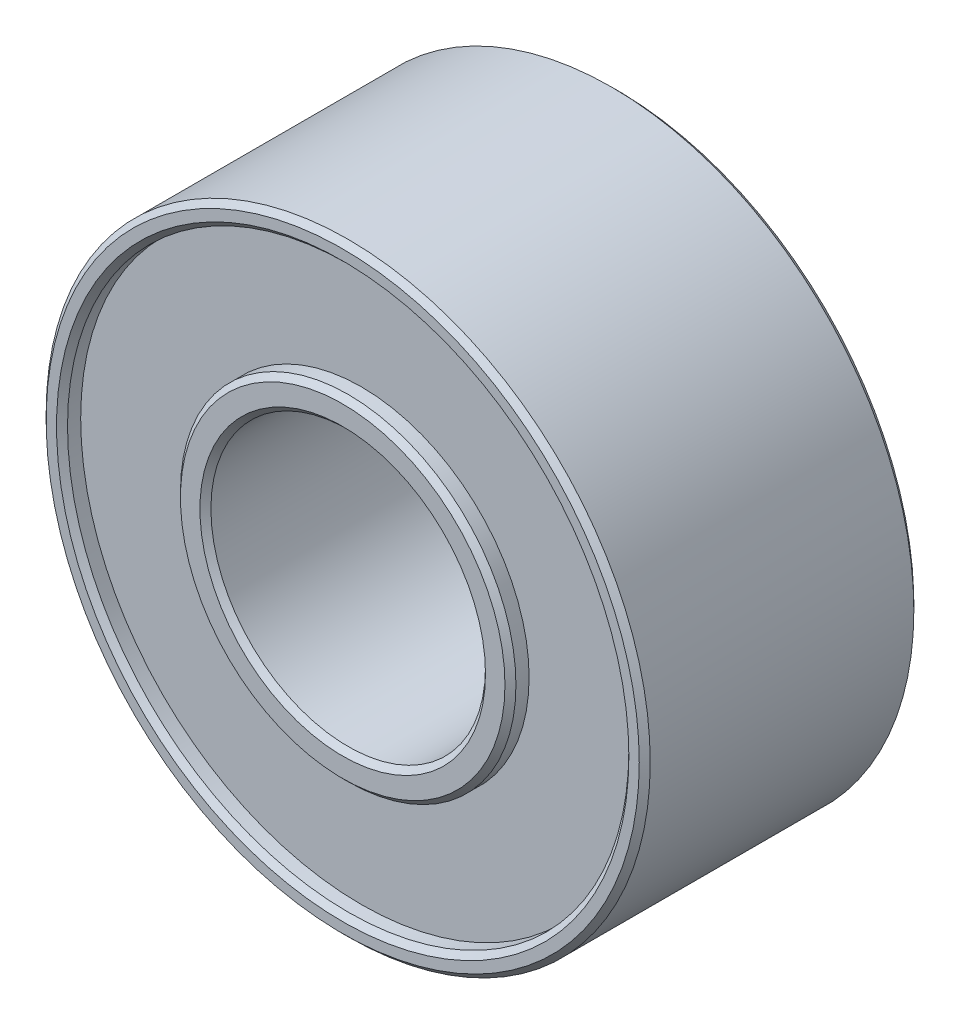
ISO-10303-21;
HEADER;
FILE_DESCRIPTION(('STEP AP214'),'2;1');
FILE_NAME('part.step','',(''),(''),'','','');
FILE_SCHEMA(('AUTOMOTIVE_DESIGN { 1 0 10303 214 1 1 1 1 }'));
ENDSEC;
DATA;
#1=APPLICATION_CONTEXT('core data for automotive mechanical design processes');
#2=APPLICATION_PROTOCOL_DEFINITION('international standard','automotive_design',2000,#1);
#3=PRODUCT_CONTEXT('',#1,'mechanical');
#4=PRODUCT('Part','Part','',(#3));
#5=PRODUCT_RELATED_PRODUCT_CATEGORY('part','',(#4));
#6=PRODUCT_DEFINITION_FORMATION('','',#4);
#7=PRODUCT_DEFINITION_CONTEXT('part definition',#1,'design');
#8=PRODUCT_DEFINITION('design','',#6,#7);
#9=PRODUCT_DEFINITION_SHAPE('','',#8);
#10=(LENGTH_UNIT() NAMED_UNIT(*) SI_UNIT(.MILLI.,.METRE.));
#11=(NAMED_UNIT(*) PLANE_ANGLE_UNIT() SI_UNIT($,.RADIAN.));
#12=(NAMED_UNIT(*) SI_UNIT($,.STERADIAN.) SOLID_ANGLE_UNIT());
#13=UNCERTAINTY_MEASURE_WITH_UNIT(LENGTH_MEASURE(1.E-05),#10,'distance_accuracy_value','');
#14=(GEOMETRIC_REPRESENTATION_CONTEXT(3) GLOBAL_UNCERTAINTY_ASSIGNED_CONTEXT((#13)) GLOBAL_UNIT_ASSIGNED_CONTEXT((#10,
#11,#12)) REPRESENTATION_CONTEXT('',''));
#15=CARTESIAN_POINT('',(0.,0.,0.));
#16=DIRECTION('',(0.,0.,1.));
#17=DIRECTION('',(1.,0.,0.));
#18=AXIS2_PLACEMENT_3D('',#15,#16,#17);
#19=CARTESIAN_POINT('',(0.,3.05451224312112,-2.5));
#20=DIRECTION('',(0.,0.,-1.));
#21=DIRECTION('',(-1.,0.,0.));
#22=AXIS2_PLACEMENT_3D('',#19,#20,#21);
#23=PLANE('',#22);
#24=CARTESIAN_POINT('',(0.,0.,-2.5));
#25=DIRECTION('',(0.,0.,-1.));
#26=DIRECTION('',(-1.,0.,0.));
#27=AXIS2_PLACEMENT_3D('',#24,#25,#26);
#28=CIRCLE('',#27,2.95451224312112);
#29=CARTESIAN_POINT('',(-2.95451224312112,0.,-2.5));
#30=VERTEX_POINT('',#29);
#31=EDGE_CURVE('E73',#30,#30,#28,.T.);
#32=ORIENTED_EDGE('',*,*,#31,.T.);
#33=EDGE_LOOP('',(#32));
#34=FACE_BOUND('',#33,.T.);
#35=CARTESIAN_POINT('',(0.,0.,-2.5));
#36=DIRECTION('',(0.,0.,-1.));
#37=DIRECTION('',(-1.,0.,0.));
#38=AXIS2_PLACEMENT_3D('',#35,#36,#37);
#39=CIRCLE('',#38,2.6);
#40=CARTESIAN_POINT('',(-2.6,0.,-2.5));
#41=VERTEX_POINT('',#40);
#42=EDGE_CURVE('E76',#41,#41,#39,.F.);
#43=ORIENTED_EDGE('',*,*,#42,.T.);
#44=EDGE_LOOP('',(#43));
#45=FACE_BOUND('',#44,.T.);
#46=ADVANCED_FACE('F32',(#34,#45),#23,.T.);
#47=CARTESIAN_POINT('',(0.,0.,-19.0782719959034));
#48=DIRECTION('',(0.,0.,-1.));
#49=DIRECTION('',(-1.,0.,0.));
#50=AXIS2_PLACEMENT_3D('',#47,#48,#49);
#51=CYLINDRICAL_SURFACE('',#50,3.05451224312112);
#52=CARTESIAN_POINT('',(0.,0.,-2.4));
#53=DIRECTION('',(0.,0.,-1.));
#54=DIRECTION('',(-1.,0.,0.));
#55=AXIS2_PLACEMENT_3D('',#52,#53,#54);
#56=CIRCLE('',#55,3.05451224312112);
#57=CARTESIAN_POINT('',(-3.05451224312112,0.,-2.4));
#58=VERTEX_POINT('',#57);
#59=EDGE_CURVE('E70',#58,#58,#56,.F.);
#60=ORIENTED_EDGE('',*,*,#59,.T.);
#61=EDGE_LOOP('',(#60));
#62=FACE_BOUND('',#61,.T.);
#63=CARTESIAN_POINT('',(0.,0.,-2.16032537077569));
#64=DIRECTION('',(0.,0.,-1.));
#65=DIRECTION('',(-1.,0.,0.));
#66=AXIS2_PLACEMENT_3D('',#63,#64,#65);
#67=CIRCLE('',#66,3.05451224312112);
#68=CARTESIAN_POINT('',(-3.05451224312112,0.,-2.16032537077569));
#69=VERTEX_POINT('',#68);
#70=EDGE_CURVE('E88',#69,#69,#67,.T.);
#71=ORIENTED_EDGE('',*,*,#70,.T.);
#72=EDGE_LOOP('',(#71));
#73=FACE_BOUND('',#72,.T.);
#74=ADVANCED_FACE('F119',(#62,#73),#51,.T.);
#75=CARTESIAN_POINT('',(0.,5.11092244233942,-2.16032537077569));
#76=DIRECTION('',(0.,0.,-1.));
#77=DIRECTION('',(-1.,0.,0.));
#78=AXIS2_PLACEMENT_3D('',#75,#76,#77);
#79=PLANE('',#78);
#80=CARTESIAN_POINT('',(0.,0.,-2.16032537077569));
#81=DIRECTION('',(0.,0.,-1.));
#82=DIRECTION('',(-1.,0.,0.));
#83=AXIS2_PLACEMENT_3D('',#80,#81,#82);
#84=CIRCLE('',#83,5.11092244233942);
#85=CARTESIAN_POINT('',(-5.11092244233942,0.,-2.16032537077569));
#86=VERTEX_POINT('',#85);
#87=EDGE_CURVE('E91',#86,#86,#84,.T.);
#88=ORIENTED_EDGE('',*,*,#87,.T.);
#89=EDGE_LOOP('',(#88));
#90=FACE_BOUND('',#89,.T.);
#91=ORIENTED_EDGE('',*,*,#70,.F.);
#92=EDGE_LOOP('',(#91));
#93=FACE_BOUND('',#92,.T.);
#94=ADVANCED_FACE('F125',(#90,#93),#79,.T.);
#95=CARTESIAN_POINT('',(0.,0.,-19.0782719959034));
#96=DIRECTION('',(0.,0.,-1.));
#97=DIRECTION('',(-1.,0.,0.));
#98=AXIS2_PLACEMENT_3D('',#95,#96,#97);
#99=CYLINDRICAL_SURFACE('',#98,5.11092244233942);
#100=CARTESIAN_POINT('',(0.,0.,-2.39999999999999));
#101=DIRECTION('',(0.,0.,-1.));
#102=DIRECTION('',(-1.,0.,0.));
#103=AXIS2_PLACEMENT_3D('',#100,#101,#102);
#104=CIRCLE('',#103,5.11092244233942);
#105=CARTESIAN_POINT('',(-5.11092244233942,0.,-2.39999999999999));
#106=VERTEX_POINT('',#105);
#107=EDGE_CURVE('E85',#106,#106,#104,.T.);
#108=ORIENTED_EDGE('',*,*,#107,.T.);
#109=EDGE_LOOP('',(#108));
#110=FACE_BOUND('',#109,.T.);
#111=ORIENTED_EDGE('',*,*,#87,.F.);
#112=EDGE_LOOP('',(#111));
#113=FACE_BOUND('',#112,.T.);
#114=ADVANCED_FACE('F180',(#110,#113),#99,.F.);
#115=CARTESIAN_POINT('',(0.,5.5,-2.5));
#116=DIRECTION('',(0.,0.,-1.));
#117=DIRECTION('',(-1.,0.,0.));
#118=AXIS2_PLACEMENT_3D('',#115,#116,#117);
#119=PLANE('',#118);
#120=CARTESIAN_POINT('',(0.,0.,-2.5));
#121=DIRECTION('',(0.,0.,-1.));
#122=DIRECTION('',(-1.,0.,0.));
#123=AXIS2_PLACEMENT_3D('',#120,#121,#122);
#124=CIRCLE('',#123,5.21092244233942);
#125=CARTESIAN_POINT('',(-5.21092244233942,0.,-2.5));
#126=VERTEX_POINT('',#125);
#127=EDGE_CURVE('E79',#126,#126,#124,.F.);
#128=ORIENTED_EDGE('',*,*,#127,.T.);
#129=EDGE_LOOP('',(#128));
#130=FACE_BOUND('',#129,.T.);
#131=CARTESIAN_POINT('',(0.,0.,-2.5));
#132=DIRECTION('',(0.,0.,-1.));
#133=DIRECTION('',(-1.,0.,0.));
#134=AXIS2_PLACEMENT_3D('',#131,#132,#133);
#135=CIRCLE('',#134,5.4);
#136=CARTESIAN_POINT('',(-5.4,0.,-2.5));
#137=VERTEX_POINT('',#136);
#138=EDGE_CURVE('E82',#137,#137,#135,.T.);
#139=ORIENTED_EDGE('',*,*,#138,.T.);
#140=EDGE_LOOP('',(#139));
#141=FACE_BOUND('',#140,.T.);
#142=ADVANCED_FACE('F175',(#130,#141),#119,.T.);
#143=CARTESIAN_POINT('',(0.,0.,-19.0782719959034));
#144=DIRECTION('',(0.,0.,-1.));
#145=DIRECTION('',(-1.,0.,0.));
#146=AXIS2_PLACEMENT_3D('',#143,#144,#145);
#147=CYLINDRICAL_SURFACE('',#146,5.5);
#148=CARTESIAN_POINT('',(0.,0.,2.4));
#149=DIRECTION('',(0.,0.,1.));
#150=DIRECTION('',(1.,0.,0.));
#151=AXIS2_PLACEMENT_3D('',#148,#149,#150);
#152=CIRCLE('',#151,5.5);
#153=CARTESIAN_POINT('',(5.5,0.,2.4));
#154=VERTEX_POINT('',#153);
#155=EDGE_CURVE('E10',#154,#154,#152,.F.);
#156=ORIENTED_EDGE('',*,*,#155,.T.);
#157=EDGE_LOOP('',(#156));
#158=FACE_BOUND('',#157,.T.);
#159=CARTESIAN_POINT('',(0.,0.,-2.4));
#160=DIRECTION('',(0.,0.,-1.));
#161=DIRECTION('',(-1.,0.,0.));
#162=AXIS2_PLACEMENT_3D('',#159,#160,#161);
#163=CIRCLE('',#162,5.5);
#164=CARTESIAN_POINT('',(-5.5,0.,-2.4));
#165=VERTEX_POINT('',#164);
#166=EDGE_CURVE('E39',#165,#165,#163,.F.);
#167=ORIENTED_EDGE('',*,*,#166,.T.);
#168=EDGE_LOOP('',(#167));
#169=FACE_BOUND('',#168,.T.);
#170=ADVANCED_FACE('F166',(#158,#169),#147,.T.);
#171=CARTESIAN_POINT('',(0.,5.5,2.5));
#172=DIRECTION('',(0.,0.,1.));
#173=DIRECTION('',(1.,0.,0.));
#174=AXIS2_PLACEMENT_3D('',#171,#172,#173);
#175=PLANE('',#174);
#176=CARTESIAN_POINT('',(0.,0.,2.5));
#177=DIRECTION('',(0.,0.,1.));
#178=DIRECTION('',(1.,0.,0.));
#179=AXIS2_PLACEMENT_3D('',#176,#177,#178);
#180=CIRCLE('',#179,5.21092244233942);
#181=CARTESIAN_POINT('',(5.21092244233942,0.,2.5));
#182=VERTEX_POINT('',#181);
#183=EDGE_CURVE('E64',#182,#182,#180,.F.);
#184=ORIENTED_EDGE('',*,*,#183,.T.);
#185=EDGE_LOOP('',(#184));
#186=FACE_BOUND('',#185,.T.);
#187=CARTESIAN_POINT('',(0.,0.,2.5));
#188=DIRECTION('',(0.,0.,1.));
#189=DIRECTION('',(1.,0.,0.));
#190=AXIS2_PLACEMENT_3D('',#187,#188,#189);
#191=CIRCLE('',#190,5.4);
#192=CARTESIAN_POINT('',(5.4,0.,2.5));
#193=VERTEX_POINT('',#192);
#194=EDGE_CURVE('E67',#193,#193,#191,.T.);
#195=ORIENTED_EDGE('',*,*,#194,.T.);
#196=EDGE_LOOP('',(#195));
#197=FACE_BOUND('',#196,.T.);
#198=ADVANCED_FACE('F164',(#186,#197),#175,.T.);
#199=CARTESIAN_POINT('',(0.,0.,-19.0782719959034));
#200=DIRECTION('',(0.,0.,-1.));
#201=DIRECTION('',(-1.,0.,0.));
#202=AXIS2_PLACEMENT_3D('',#199,#200,#201);
#203=CYLINDRICAL_SURFACE('',#202,5.11092244233942);
#204=CARTESIAN_POINT('',(0.,0.,2.40000000000001));
#205=DIRECTION('',(0.,0.,1.));
#206=DIRECTION('',(1.,0.,0.));
#207=AXIS2_PLACEMENT_3D('',#204,#205,#206);
#208=CIRCLE('',#207,5.11092244233942);
#209=CARTESIAN_POINT('',(5.11092244233942,0.,2.40000000000001));
#210=VERTEX_POINT('',#209);
#211=EDGE_CURVE('E61',#210,#210,#208,.T.);
#212=ORIENTED_EDGE('',*,*,#211,.T.);
#213=EDGE_LOOP('',(#212));
#214=FACE_BOUND('',#213,.T.);
#215=CARTESIAN_POINT('',(0.,0.,2.1603253707757));
#216=DIRECTION('',(0.,0.,-1.));
#217=DIRECTION('',(-1.,0.,0.));
#218=AXIS2_PLACEMENT_3D('',#215,#216,#217);
#219=CIRCLE('',#218,5.11092244233942);
#220=CARTESIAN_POINT('',(-5.11092244233942,0.,2.1603253707757));
#221=VERTEX_POINT('',#220);
#222=EDGE_CURVE('E94',#221,#221,#219,.T.);
#223=ORIENTED_EDGE('',*,*,#222,.T.);
#224=EDGE_LOOP('',(#223));
#225=FACE_BOUND('',#224,.T.);
#226=ADVANCED_FACE('F116',(#214,#225),#203,.F.);
#227=CARTESIAN_POINT('',(0.,5.11092244233942,2.1603253707757));
#228=DIRECTION('',(0.,0.,1.));
#229=DIRECTION('',(1.,0.,0.));
#230=AXIS2_PLACEMENT_3D('',#227,#228,#229);
#231=PLANE('',#230);
#232=CARTESIAN_POINT('',(0.,0.,2.1603253707757));
#233=DIRECTION('',(0.,0.,-1.));
#234=DIRECTION('',(-1.,0.,0.));
#235=AXIS2_PLACEMENT_3D('',#232,#233,#234);
#236=CIRCLE('',#235,3.05451224312112);
#237=CARTESIAN_POINT('',(-3.05451224312112,0.,2.1603253707757));
#238=VERTEX_POINT('',#237);
#239=EDGE_CURVE('E97',#238,#238,#236,.T.);
#240=ORIENTED_EDGE('',*,*,#239,.T.);
#241=EDGE_LOOP('',(#240));
#242=FACE_BOUND('',#241,.T.);
#243=ORIENTED_EDGE('',*,*,#222,.F.);
#244=EDGE_LOOP('',(#243));
#245=FACE_BOUND('',#244,.T.);
#246=ADVANCED_FACE('F101',(#242,#245),#231,.T.);
#247=CARTESIAN_POINT('',(0.,0.,-19.0782719959034));
#248=DIRECTION('',(0.,0.,-1.));
#249=DIRECTION('',(-1.,0.,0.));
#250=AXIS2_PLACEMENT_3D('',#247,#248,#249);
#251=CYLINDRICAL_SURFACE('',#250,3.05451224312112);
#252=CARTESIAN_POINT('',(0.,0.,2.4));
#253=DIRECTION('',(0.,0.,1.));
#254=DIRECTION('',(1.,0.,0.));
#255=AXIS2_PLACEMENT_3D('',#252,#253,#254);
#256=CIRCLE('',#255,3.05451224312112);
#257=CARTESIAN_POINT('',(3.05451224312112,0.,2.4));
#258=VERTEX_POINT('',#257);
#259=EDGE_CURVE('E58',#258,#258,#256,.F.);
#260=ORIENTED_EDGE('',*,*,#259,.T.);
#261=EDGE_LOOP('',(#260));
#262=FACE_BOUND('',#261,.T.);
#263=ORIENTED_EDGE('',*,*,#239,.F.);
#264=EDGE_LOOP('',(#263));
#265=FACE_BOUND('',#264,.T.);
#266=ADVANCED_FACE('F104',(#262,#265),#251,.T.);
#267=CARTESIAN_POINT('',(0.,3.05451224312112,2.5));
#268=DIRECTION('',(0.,0.,1.));
#269=DIRECTION('',(1.,0.,0.));
#270=AXIS2_PLACEMENT_3D('',#267,#268,#269);
#271=PLANE('',#270);
#272=CARTESIAN_POINT('',(0.,0.,2.5));
#273=DIRECTION('',(0.,0.,1.));
#274=DIRECTION('',(1.,0.,0.));
#275=AXIS2_PLACEMENT_3D('',#272,#273,#274);
#276=CIRCLE('',#275,2.95451224312112);
#277=CARTESIAN_POINT('',(2.95451224312112,0.,2.5));
#278=VERTEX_POINT('',#277);
#279=EDGE_CURVE('E52',#278,#278,#276,.T.);
#280=ORIENTED_EDGE('',*,*,#279,.T.);
#281=EDGE_LOOP('',(#280));
#282=FACE_BOUND('',#281,.T.);
#283=CARTESIAN_POINT('',(0.,0.,2.5));
#284=DIRECTION('',(0.,0.,1.));
#285=DIRECTION('',(1.,0.,0.));
#286=AXIS2_PLACEMENT_3D('',#283,#284,#285);
#287=CIRCLE('',#286,2.6);
#288=CARTESIAN_POINT('',(2.6,0.,2.5));
#289=VERTEX_POINT('',#288);
#290=EDGE_CURVE('E55',#289,#289,#287,.F.);
#291=ORIENTED_EDGE('',*,*,#290,.T.);
#292=EDGE_LOOP('',(#291));
#293=FACE_BOUND('',#292,.T.);
#294=ADVANCED_FACE('F106',(#282,#293),#271,.T.);
#295=CARTESIAN_POINT('',(0.,0.,-19.0782719959034));
#296=DIRECTION('',(0.,0.,-1.));
#297=DIRECTION('',(-1.,0.,0.));
#298=AXIS2_PLACEMENT_3D('',#295,#296,#297);
#299=CYLINDRICAL_SURFACE('',#298,2.5);
#300=CARTESIAN_POINT('',(0.,0.,-2.4));
#301=DIRECTION('',(0.,0.,-1.));
#302=DIRECTION('',(-1.,0.,0.));
#303=AXIS2_PLACEMENT_3D('',#300,#301,#302);
#304=CIRCLE('',#303,2.5);
#305=CARTESIAN_POINT('',(-2.5,0.,-2.4));
#306=VERTEX_POINT('',#305);
#307=EDGE_CURVE('E43',#306,#306,#304,.T.);
#308=ORIENTED_EDGE('',*,*,#307,.T.);
#309=EDGE_LOOP('',(#308));
#310=FACE_BOUND('',#309,.T.);
#311=CARTESIAN_POINT('',(0.,0.,2.4));
#312=DIRECTION('',(0.,0.,1.));
#313=DIRECTION('',(1.,0.,0.));
#314=AXIS2_PLACEMENT_3D('',#311,#312,#313);
#315=CIRCLE('',#314,2.5);
#316=CARTESIAN_POINT('',(2.5,0.,2.4));
#317=VERTEX_POINT('',#316);
#318=EDGE_CURVE('E47',#317,#317,#315,.T.);
#319=ORIENTED_EDGE('',*,*,#318,.T.);
#320=EDGE_LOOP('',(#319));
#321=FACE_BOUND('',#320,.T.);
#322=ADVANCED_FACE('F113',(#310,#321),#299,.F.);
#323=CARTESIAN_POINT('',(0.,0.,-2.39999999999999));
#324=DIRECTION('',(0.,0.,-1.));
#325=DIRECTION('',(-1.,0.,0.));
#326=AXIS2_PLACEMENT_3D('',#323,#324,#325);
#327=CONICAL_SURFACE('',#326,5.11092244233942,0.78539816339744);
#328=ORIENTED_EDGE('',*,*,#127,.F.);
#329=EDGE_LOOP('',(#328));
#330=FACE_BOUND('',#329,.T.);
#331=ORIENTED_EDGE('',*,*,#107,.F.);
#332=EDGE_LOOP('',(#331));
#333=FACE_BOUND('',#332,.T.);
#334=ADVANCED_FACE('F131',(#330,#333),#327,.F.);
#335=CARTESIAN_POINT('',(0.,0.,-2.5));
#336=DIRECTION('',(0.,0.,1.));
#337=DIRECTION('',(1.,0.,0.));
#338=AXIS2_PLACEMENT_3D('',#335,#336,#337);
#339=CONICAL_SURFACE('',#338,2.95451224312112,0.785398163397448);
#340=ORIENTED_EDGE('',*,*,#59,.F.);
#341=EDGE_LOOP('',(#340));
#342=FACE_BOUND('',#341,.T.);
#343=ORIENTED_EDGE('',*,*,#31,.F.);
#344=EDGE_LOOP('',(#343));
#345=FACE_BOUND('',#344,.T.);
#346=ADVANCED_FACE('F134',(#342,#345),#339,.T.);
#347=CARTESIAN_POINT('',(0.,0.,2.5));
#348=DIRECTION('',(0.,0.,1.));
#349=DIRECTION('',(1.,0.,0.));
#350=AXIS2_PLACEMENT_3D('',#347,#348,#349);
#351=CONICAL_SURFACE('',#350,5.21092244233942,0.785398163397466);
#352=ORIENTED_EDGE('',*,*,#211,.F.);
#353=EDGE_LOOP('',(#352));
#354=FACE_BOUND('',#353,.T.);
#355=ORIENTED_EDGE('',*,*,#183,.F.);
#356=EDGE_LOOP('',(#355));
#357=FACE_BOUND('',#356,.T.);
#358=ADVANCED_FACE('F138',(#354,#357),#351,.F.);
#359=CARTESIAN_POINT('',(0.,0.,2.4));
#360=DIRECTION('',(0.,0.,-1.));
#361=DIRECTION('',(-1.,0.,0.));
#362=AXIS2_PLACEMENT_3D('',#359,#360,#361);
#363=CONICAL_SURFACE('',#362,3.05451224312112,0.785398163397448);
#364=ORIENTED_EDGE('',*,*,#279,.F.);
#365=EDGE_LOOP('',(#364));
#366=FACE_BOUND('',#365,.T.);
#367=ORIENTED_EDGE('',*,*,#259,.F.);
#368=EDGE_LOOP('',(#367));
#369=FACE_BOUND('',#368,.T.);
#370=ADVANCED_FACE('F142',(#366,#369),#363,.T.);
#371=CARTESIAN_POINT('',(0.,0.,-2.4));
#372=DIRECTION('',(0.,0.,-1.));
#373=DIRECTION('',(-1.,0.,0.));
#374=AXIS2_PLACEMENT_3D('',#371,#372,#373);
#375=CONICAL_SURFACE('',#374,2.5,0.785398163397438);
#376=ORIENTED_EDGE('',*,*,#42,.F.);
#377=EDGE_LOOP('',(#376));
#378=FACE_BOUND('',#377,.T.);
#379=ORIENTED_EDGE('',*,*,#307,.F.);
#380=EDGE_LOOP('',(#379));
#381=FACE_BOUND('',#380,.T.);
#382=ADVANCED_FACE('F146',(#378,#381),#375,.F.);
#383=CARTESIAN_POINT('',(0.,0.,2.5));
#384=DIRECTION('',(0.,0.,1.));
#385=DIRECTION('',(1.,0.,0.));
#386=AXIS2_PLACEMENT_3D('',#383,#384,#385);
#387=CONICAL_SURFACE('',#386,2.6,0.785398163397438);
#388=ORIENTED_EDGE('',*,*,#318,.F.);
#389=EDGE_LOOP('',(#388));
#390=FACE_BOUND('',#389,.T.);
#391=ORIENTED_EDGE('',*,*,#290,.F.);
#392=EDGE_LOOP('',(#391));
#393=FACE_BOUND('',#392,.T.);
#394=ADVANCED_FACE('F150',(#390,#393),#387,.F.);
#395=CARTESIAN_POINT('',(0.,0.,2.4));
#396=DIRECTION('',(0.,0.,-1.));
#397=DIRECTION('',(-1.,0.,0.));
#398=AXIS2_PLACEMENT_3D('',#395,#396,#397);
#399=CONICAL_SURFACE('',#398,5.5,0.785398163397448);
#400=ORIENTED_EDGE('',*,*,#194,.F.);
#401=EDGE_LOOP('',(#400));
#402=FACE_BOUND('',#401,.T.);
#403=ORIENTED_EDGE('',*,*,#155,.F.);
#404=EDGE_LOOP('',(#403));
#405=FACE_BOUND('',#404,.T.);
#406=ADVANCED_FACE('F153',(#402,#405),#399,.T.);
#407=CARTESIAN_POINT('',(0.,0.,-2.5));
#408=DIRECTION('',(0.,0.,1.));
#409=DIRECTION('',(1.,0.,0.));
#410=AXIS2_PLACEMENT_3D('',#407,#408,#409);
#411=CONICAL_SURFACE('',#410,5.4,0.785398163397457);
#412=ORIENTED_EDGE('',*,*,#166,.F.);
#413=EDGE_LOOP('',(#412));
#414=FACE_BOUND('',#413,.T.);
#415=ORIENTED_EDGE('',*,*,#138,.F.);
#416=EDGE_LOOP('',(#415));
#417=FACE_BOUND('',#416,.T.);
#418=ADVANCED_FACE('F34',(#414,#417),#411,.T.);
#419=CLOSED_SHELL('',(#46,#74,#94,#114,#142,#170,#198,#226,#246,#266,#294,#322,#334,#346,#358,
#370,#382,#394,#406,#418));
#420=MANIFOLD_SOLID_BREP('B2',#419);
#421=ADVANCED_BREP_SHAPE_REPRESENTATION('',(#18,#420),#14);
#422=SHAPE_DEFINITION_REPRESENTATION(#9,#421);
ENDSEC;
END-ISO-10303-21;
